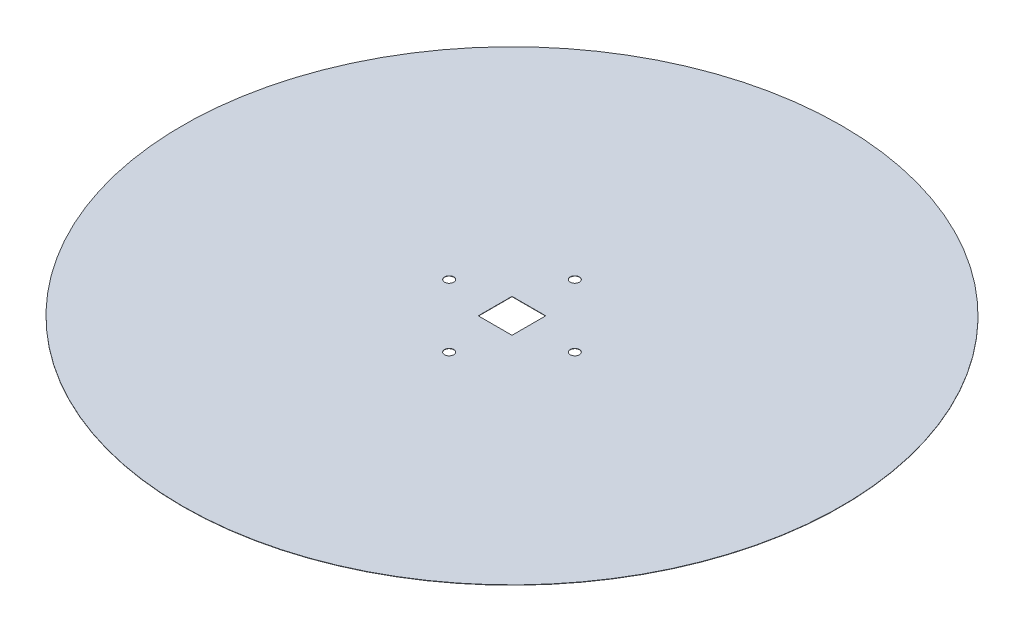
ISO-10303-21;
HEADER;
FILE_DESCRIPTION(('STEP AP214'),'2;1');
FILE_NAME('part.step','',(''),(''),'','','');
FILE_SCHEMA(('AUTOMOTIVE_DESIGN { 1 0 10303 214 1 1 1 1 }'));
ENDSEC;
DATA;
#1=APPLICATION_CONTEXT('core data for automotive mechanical design processes');
#2=APPLICATION_PROTOCOL_DEFINITION('international standard','automotive_design',2000,#1);
#3=PRODUCT_CONTEXT('',#1,'mechanical');
#4=PRODUCT('Part','Part','',(#3));
#5=PRODUCT_RELATED_PRODUCT_CATEGORY('part','',(#4));
#6=PRODUCT_DEFINITION_FORMATION('','',#4);
#7=PRODUCT_DEFINITION_CONTEXT('part definition',#1,'design');
#8=PRODUCT_DEFINITION('design','',#6,#7);
#9=PRODUCT_DEFINITION_SHAPE('','',#8);
#10=(LENGTH_UNIT() NAMED_UNIT(*) SI_UNIT(.MILLI.,.METRE.));
#11=(NAMED_UNIT(*) PLANE_ANGLE_UNIT() SI_UNIT($,.RADIAN.));
#12=(NAMED_UNIT(*) SI_UNIT($,.STERADIAN.) SOLID_ANGLE_UNIT());
#13=UNCERTAINTY_MEASURE_WITH_UNIT(LENGTH_MEASURE(1.E-05),#10,'distance_accuracy_value','');
#14=(GEOMETRIC_REPRESENTATION_CONTEXT(3) GLOBAL_UNCERTAINTY_ASSIGNED_CONTEXT((#13)) GLOBAL_UNIT_ASSIGNED_CONTEXT((#10,
#11,#12)) REPRESENTATION_CONTEXT('',''));
#15=CARTESIAN_POINT('',(0.,0.,0.));
#16=DIRECTION('',(0.,0.,1.));
#17=DIRECTION('',(1.,0.,0.));
#18=AXIS2_PLACEMENT_3D('',#15,#16,#17);
#19=CARTESIAN_POINT('',(0.,0.2,0.));
#20=DIRECTION('',(0.,1.,0.));
#21=DIRECTION('',(0.,0.,1.));
#22=AXIS2_PLACEMENT_3D('',#19,#20,#21);
#23=PLANE('',#22);
#24=CARTESIAN_POINT('',(0.,0.2,-41.));
#25=DIRECTION('',(0.,1.,0.));
#26=DIRECTION('',(0.,0.,1.));
#27=AXIS2_PLACEMENT_3D('',#24,#25,#26);
#28=CIRCLE('',#27,3.);
#29=CARTESIAN_POINT('',(0.,0.2,-38.));
#30=VERTEX_POINT('',#29);
#31=EDGE_CURVE('E105',#30,#30,#28,.T.);
#32=ORIENTED_EDGE('',*,*,#31,.F.);
#33=EDGE_LOOP('',(#32));
#34=FACE_BOUND('',#33,.T.);
#35=CARTESIAN_POINT('',(-41.,0.2,0.));
#36=DIRECTION('',(0.,1.,0.));
#37=DIRECTION('',(0.,0.,1.));
#38=AXIS2_PLACEMENT_3D('',#35,#36,#37);
#39=CIRCLE('',#38,3.);
#40=CARTESIAN_POINT('',(-41.,0.2,3.00000000000001));
#41=VERTEX_POINT('',#40);
#42=EDGE_CURVE('E123',#41,#41,#39,.T.);
#43=ORIENTED_EDGE('',*,*,#42,.F.);
#44=EDGE_LOOP('',(#43));
#45=FACE_BOUND('',#44,.T.);
#46=CARTESIAN_POINT('',(41.,0.2,0.));
#47=DIRECTION('',(0.,1.,0.));
#48=DIRECTION('',(0.,0.,1.));
#49=AXIS2_PLACEMENT_3D('',#46,#47,#48);
#50=CIRCLE('',#49,3.);
#51=CARTESIAN_POINT('',(41.,0.2,2.99999999999998));
#52=VERTEX_POINT('',#51);
#53=EDGE_CURVE('E114',#52,#52,#50,.T.);
#54=ORIENTED_EDGE('',*,*,#53,.F.);
#55=EDGE_LOOP('',(#54));
#56=FACE_BOUND('',#55,.T.);
#57=CARTESIAN_POINT('',(0.,0.2,41.));
#58=DIRECTION('',(0.,1.,0.));
#59=DIRECTION('',(0.,0.,1.));
#60=AXIS2_PLACEMENT_3D('',#57,#58,#59);
#61=CIRCLE('',#60,3.);
#62=CARTESIAN_POINT('',(0.,0.2,44.));
#63=VERTEX_POINT('',#62);
#64=EDGE_CURVE('E113',#63,#63,#61,.T.);
#65=ORIENTED_EDGE('',*,*,#64,.F.);
#66=EDGE_LOOP('',(#65));
#67=FACE_BOUND('',#66,.T.);
#68=CARTESIAN_POINT('',(0.,0.2,0.));
#69=DIRECTION('',(0.,1.,0.));
#70=DIRECTION('',(0.,0.,1.));
#71=AXIS2_PLACEMENT_3D('',#68,#69,#70);
#72=CIRCLE('',#71,215.);
#73=CARTESIAN_POINT('',(0.,0.2,215.));
#74=VERTEX_POINT('',#73);
#75=EDGE_CURVE('E11',#74,#74,#72,.T.);
#76=ORIENTED_EDGE('',*,*,#75,.T.);
#77=EDGE_LOOP('',(#76));
#78=FACE_BOUND('',#77,.T.);
#79=DIRECTION('',(0.,0.,1.));
#80=VECTOR('',#79,1.);
#81=CARTESIAN_POINT('',(-11.,0.2,-11.));
#82=LINE('',#81,#80);
#83=CARTESIAN_POINT('',(-11.,0.2,-11.));
#84=VERTEX_POINT('',#83);
#85=CARTESIAN_POINT('',(-11.,0.2,11.));
#86=VERTEX_POINT('',#85);
#87=EDGE_CURVE('E133',#84,#86,#82,.T.);
#88=ORIENTED_EDGE('',*,*,#87,.F.);
#89=DIRECTION('',(1.,0.,0.));
#90=VECTOR('',#89,1.);
#91=CARTESIAN_POINT('',(-11.,0.2,-11.));
#92=LINE('',#91,#90);
#93=CARTESIAN_POINT('',(11.,0.2,-11.));
#94=VERTEX_POINT('',#93);
#95=EDGE_CURVE('E55',#84,#94,#92,.T.);
#96=ORIENTED_EDGE('',*,*,#95,.T.);
#97=DIRECTION('',(0.,0.,1.));
#98=VECTOR('',#97,1.);
#99=CARTESIAN_POINT('',(11.,0.2,-11.));
#100=LINE('',#99,#98);
#101=CARTESIAN_POINT('',(11.,0.2,11.));
#102=VERTEX_POINT('',#101);
#103=EDGE_CURVE('E87',#94,#102,#100,.T.);
#104=ORIENTED_EDGE('',*,*,#103,.T.);
#105=DIRECTION('',(1.,0.,0.));
#106=VECTOR('',#105,1.);
#107=CARTESIAN_POINT('',(-11.,0.2,11.));
#108=LINE('',#107,#106);
#109=EDGE_CURVE('E137',#86,#102,#108,.T.);
#110=ORIENTED_EDGE('',*,*,#109,.F.);
#111=EDGE_LOOP('',(#88,#96,#104,#110));
#112=FACE_BOUND('',#111,.T.);
#113=ADVANCED_FACE('F39',(#34,#45,#56,#67,#78,#112),#23,.T.);
#114=CARTESIAN_POINT('',(0.,0.,0.));
#115=DIRECTION('',(0.,1.,0.));
#116=DIRECTION('',(0.,0.,1.));
#117=AXIS2_PLACEMENT_3D('',#114,#115,#116);
#118=PLANE('',#117);
#119=CARTESIAN_POINT('',(0.,0.,-41.));
#120=DIRECTION('',(0.,1.,0.));
#121=DIRECTION('',(0.,0.,1.));
#122=AXIS2_PLACEMENT_3D('',#119,#120,#121);
#123=CIRCLE('',#122,3.);
#124=CARTESIAN_POINT('',(0.,0.,-38.));
#125=VERTEX_POINT('',#124);
#126=EDGE_CURVE('E183',#125,#125,#123,.F.);
#127=ORIENTED_EDGE('',*,*,#126,.F.);
#128=EDGE_LOOP('',(#127));
#129=FACE_BOUND('',#128,.T.);
#130=CARTESIAN_POINT('',(-41.,0.,0.));
#131=DIRECTION('',(0.,1.,0.));
#132=DIRECTION('',(0.,0.,1.));
#133=AXIS2_PLACEMENT_3D('',#130,#131,#132);
#134=CIRCLE('',#133,3.);
#135=CARTESIAN_POINT('',(-41.,0.,3.00000000000001));
#136=VERTEX_POINT('',#135);
#137=EDGE_CURVE('E199',#136,#136,#134,.F.);
#138=ORIENTED_EDGE('',*,*,#137,.F.);
#139=EDGE_LOOP('',(#138));
#140=FACE_BOUND('',#139,.T.);
#141=CARTESIAN_POINT('',(41.,0.,0.));
#142=DIRECTION('',(0.,1.,0.));
#143=DIRECTION('',(0.,0.,1.));
#144=AXIS2_PLACEMENT_3D('',#141,#142,#143);
#145=CIRCLE('',#144,3.);
#146=CARTESIAN_POINT('',(41.,0.,2.99999999999998));
#147=VERTEX_POINT('',#146);
#148=EDGE_CURVE('E193',#147,#147,#145,.F.);
#149=ORIENTED_EDGE('',*,*,#148,.F.);
#150=EDGE_LOOP('',(#149));
#151=FACE_BOUND('',#150,.T.);
#152=CARTESIAN_POINT('',(0.,0.,41.));
#153=DIRECTION('',(0.,1.,0.));
#154=DIRECTION('',(0.,0.,1.));
#155=AXIS2_PLACEMENT_3D('',#152,#153,#154);
#156=CIRCLE('',#155,3.);
#157=CARTESIAN_POINT('',(0.,0.,44.));
#158=VERTEX_POINT('',#157);
#159=EDGE_CURVE('E109',#158,#158,#156,.F.);
#160=ORIENTED_EDGE('',*,*,#159,.F.);
#161=EDGE_LOOP('',(#160));
#162=FACE_BOUND('',#161,.T.);
#163=CARTESIAN_POINT('',(0.,0.,0.));
#164=DIRECTION('',(0.,1.,0.));
#165=DIRECTION('',(0.,0.,1.));
#166=AXIS2_PLACEMENT_3D('',#163,#164,#165);
#167=CIRCLE('',#166,215.);
#168=CARTESIAN_POINT('',(0.,0.,215.));
#169=VERTEX_POINT('',#168);
#170=EDGE_CURVE('E43',#169,#169,#167,.T.);
#171=ORIENTED_EDGE('',*,*,#170,.F.);
#172=EDGE_LOOP('',(#171));
#173=FACE_BOUND('',#172,.T.);
#174=DIRECTION('',(-1.,0.,0.));
#175=VECTOR('',#174,1.);
#176=CARTESIAN_POINT('',(-11.,0.,-11.));
#177=LINE('',#176,#175);
#178=CARTESIAN_POINT('',(11.,0.,-11.));
#179=VERTEX_POINT('',#178);
#180=CARTESIAN_POINT('',(-11.,0.,-11.));
#181=VERTEX_POINT('',#180);
#182=EDGE_CURVE('E93',#179,#181,#177,.T.);
#183=ORIENTED_EDGE('',*,*,#182,.T.);
#184=DIRECTION('',(0.,0.,-1.));
#185=VECTOR('',#184,1.);
#186=CARTESIAN_POINT('',(-11.,0.,-11.));
#187=LINE('',#186,#185);
#188=CARTESIAN_POINT('',(-11.,0.,11.));
#189=VERTEX_POINT('',#188);
#190=EDGE_CURVE('E90',#189,#181,#187,.T.);
#191=ORIENTED_EDGE('',*,*,#190,.F.);
#192=DIRECTION('',(-1.,0.,0.));
#193=VECTOR('',#192,1.);
#194=CARTESIAN_POINT('',(-11.,0.,11.));
#195=LINE('',#194,#193);
#196=CARTESIAN_POINT('',(11.,0.,11.));
#197=VERTEX_POINT('',#196);
#198=EDGE_CURVE('E63',#197,#189,#195,.T.);
#199=ORIENTED_EDGE('',*,*,#198,.F.);
#200=DIRECTION('',(0.,0.,-1.));
#201=VECTOR('',#200,1.);
#202=CARTESIAN_POINT('',(11.,0.,-11.));
#203=LINE('',#202,#201);
#204=EDGE_CURVE('E85',#197,#179,#203,.T.);
#205=ORIENTED_EDGE('',*,*,#204,.T.);
#206=EDGE_LOOP('',(#183,#191,#199,#205));
#207=FACE_BOUND('',#206,.T.);
#208=ADVANCED_FACE('F101',(#129,#140,#151,#162,#173,#207),#118,.F.);
#209=CARTESIAN_POINT('',(0.,0.2,0.));
#210=DIRECTION('',(0.,-1.,0.));
#211=DIRECTION('',(0.,0.,-1.));
#212=AXIS2_PLACEMENT_3D('',#209,#210,#211);
#213=CYLINDRICAL_SURFACE('',#212,215.);
#214=ORIENTED_EDGE('',*,*,#75,.F.);
#215=EDGE_LOOP('',(#214));
#216=FACE_BOUND('',#215,.T.);
#217=ORIENTED_EDGE('',*,*,#170,.T.);
#218=EDGE_LOOP('',(#217));
#219=FACE_BOUND('',#218,.T.);
#220=ADVANCED_FACE('F41',(#216,#219),#213,.T.);
#221=CARTESIAN_POINT('',(-11.,-0.000999999999999997,-11.));
#222=DIRECTION('',(0.,0.,1.));
#223=DIRECTION('',(1.,0.,0.));
#224=AXIS2_PLACEMENT_3D('',#221,#222,#223);
#225=PLANE('',#224);
#226=DIRECTION('',(0.,1.,0.));
#227=VECTOR('',#226,1.);
#228=CARTESIAN_POINT('',(11.,-0.000999999999999997,-11.));
#229=LINE('',#228,#227);
#230=EDGE_CURVE('E81',#179,#94,#229,.T.);
#231=ORIENTED_EDGE('',*,*,#230,.T.);
#232=ORIENTED_EDGE('',*,*,#95,.F.);
#233=DIRECTION('',(0.,1.,0.));
#234=VECTOR('',#233,1.);
#235=CARTESIAN_POINT('',(-11.,-0.000999999999999997,-11.));
#236=LINE('',#235,#234);
#237=EDGE_CURVE('E95',#181,#84,#236,.T.);
#238=ORIENTED_EDGE('',*,*,#237,.F.);
#239=ORIENTED_EDGE('',*,*,#182,.F.);
#240=EDGE_LOOP('',(#231,#232,#238,#239));
#241=FACE_BOUND('',#240,.T.);
#242=ADVANCED_FACE('F94',(#241),#225,.T.);
#243=CARTESIAN_POINT('',(11.,-0.000999999999999997,-11.));
#244=DIRECTION('',(-1.,0.,0.));
#245=DIRECTION('',(0.,0.,1.));
#246=AXIS2_PLACEMENT_3D('',#243,#244,#245);
#247=PLANE('',#246);
#248=DIRECTION('',(0.,1.,0.));
#249=VECTOR('',#248,1.);
#250=CARTESIAN_POINT('',(11.,-0.000999999999999997,11.));
#251=LINE('',#250,#249);
#252=EDGE_CURVE('E89',#197,#102,#251,.T.);
#253=ORIENTED_EDGE('',*,*,#252,.T.);
#254=ORIENTED_EDGE('',*,*,#103,.F.);
#255=ORIENTED_EDGE('',*,*,#230,.F.);
#256=ORIENTED_EDGE('',*,*,#204,.F.);
#257=EDGE_LOOP('',(#253,#254,#255,#256));
#258=FACE_BOUND('',#257,.T.);
#259=ADVANCED_FACE('F83',(#258),#247,.T.);
#260=CARTESIAN_POINT('',(-11.,-0.000999999999999997,11.));
#261=DIRECTION('',(0.,0.,1.));
#262=DIRECTION('',(1.,0.,0.));
#263=AXIS2_PLACEMENT_3D('',#260,#261,#262);
#264=PLANE('',#263);
#265=ORIENTED_EDGE('',*,*,#198,.T.);
#266=DIRECTION('',(0.,1.,0.));
#267=VECTOR('',#266,1.);
#268=CARTESIAN_POINT('',(-11.,-0.000999999999999997,11.));
#269=LINE('',#268,#267);
#270=EDGE_CURVE('E128',#189,#86,#269,.T.);
#271=ORIENTED_EDGE('',*,*,#270,.T.);
#272=ORIENTED_EDGE('',*,*,#109,.T.);
#273=ORIENTED_EDGE('',*,*,#252,.F.);
#274=EDGE_LOOP('',(#265,#271,#272,#273));
#275=FACE_BOUND('',#274,.T.);
#276=ADVANCED_FACE('F147',(#275),#264,.F.);
#277=CARTESIAN_POINT('',(-11.,-0.000999999999999997,-11.));
#278=DIRECTION('',(-1.,0.,0.));
#279=DIRECTION('',(0.,0.,1.));
#280=AXIS2_PLACEMENT_3D('',#277,#278,#279);
#281=PLANE('',#280);
#282=ORIENTED_EDGE('',*,*,#190,.T.);
#283=ORIENTED_EDGE('',*,*,#237,.T.);
#284=ORIENTED_EDGE('',*,*,#87,.T.);
#285=ORIENTED_EDGE('',*,*,#270,.F.);
#286=EDGE_LOOP('',(#282,#283,#284,#285));
#287=FACE_BOUND('',#286,.T.);
#288=ADVANCED_FACE('F146',(#287),#281,.F.);
#289=CARTESIAN_POINT('',(0.,-0.000999999999999997,41.));
#290=DIRECTION('',(0.,1.,0.));
#291=DIRECTION('',(0.,0.,1.));
#292=AXIS2_PLACEMENT_3D('',#289,#290,#291);
#293=CYLINDRICAL_SURFACE('',#292,3.);
#294=ORIENTED_EDGE('',*,*,#64,.T.);
#295=EDGE_LOOP('',(#294));
#296=FACE_BOUND('',#295,.T.);
#297=ORIENTED_EDGE('',*,*,#159,.T.);
#298=EDGE_LOOP('',(#297));
#299=FACE_BOUND('',#298,.T.);
#300=ADVANCED_FACE('F154',(#296,#299),#293,.F.);
#301=CARTESIAN_POINT('',(41.,-0.000999999999999997,0.));
#302=DIRECTION('',(0.,1.,0.));
#303=DIRECTION('',(0.,0.,1.));
#304=AXIS2_PLACEMENT_3D('',#301,#302,#303);
#305=CYLINDRICAL_SURFACE('',#304,3.);
#306=ORIENTED_EDGE('',*,*,#53,.T.);
#307=EDGE_LOOP('',(#306));
#308=FACE_BOUND('',#307,.T.);
#309=ORIENTED_EDGE('',*,*,#148,.T.);
#310=EDGE_LOOP('',(#309));
#311=FACE_BOUND('',#310,.T.);
#312=ADVANCED_FACE('F168',(#308,#311),#305,.F.);
#313=CARTESIAN_POINT('',(-41.,-0.000999999999999997,0.));
#314=DIRECTION('',(0.,1.,0.));
#315=DIRECTION('',(0.,0.,1.));
#316=AXIS2_PLACEMENT_3D('',#313,#314,#315);
#317=CYLINDRICAL_SURFACE('',#316,3.);
#318=ORIENTED_EDGE('',*,*,#42,.T.);
#319=EDGE_LOOP('',(#318));
#320=FACE_BOUND('',#319,.T.);
#321=ORIENTED_EDGE('',*,*,#137,.T.);
#322=EDGE_LOOP('',(#321));
#323=FACE_BOUND('',#322,.T.);
#324=ADVANCED_FACE('F172',(#320,#323),#317,.F.);
#325=CARTESIAN_POINT('',(0.,-0.000999999999999997,-41.));
#326=DIRECTION('',(0.,1.,0.));
#327=DIRECTION('',(0.,0.,1.));
#328=AXIS2_PLACEMENT_3D('',#325,#326,#327);
#329=CYLINDRICAL_SURFACE('',#328,3.);
#330=ORIENTED_EDGE('',*,*,#31,.T.);
#331=EDGE_LOOP('',(#330));
#332=FACE_BOUND('',#331,.T.);
#333=ORIENTED_EDGE('',*,*,#126,.T.);
#334=EDGE_LOOP('',(#333));
#335=FACE_BOUND('',#334,.T.);
#336=ADVANCED_FACE('F223',(#332,#335),#329,.F.);
#337=CLOSED_SHELL('',(#113,#208,#220,#242,#259,#276,#288,#300,#312,#324,#336));
#338=MANIFOLD_SOLID_BREP('B2',#337);
#339=ADVANCED_BREP_SHAPE_REPRESENTATION('',(#18,#338),#14);
#340=SHAPE_DEFINITION_REPRESENTATION(#9,#339);
ENDSEC;
END-ISO-10303-21;
